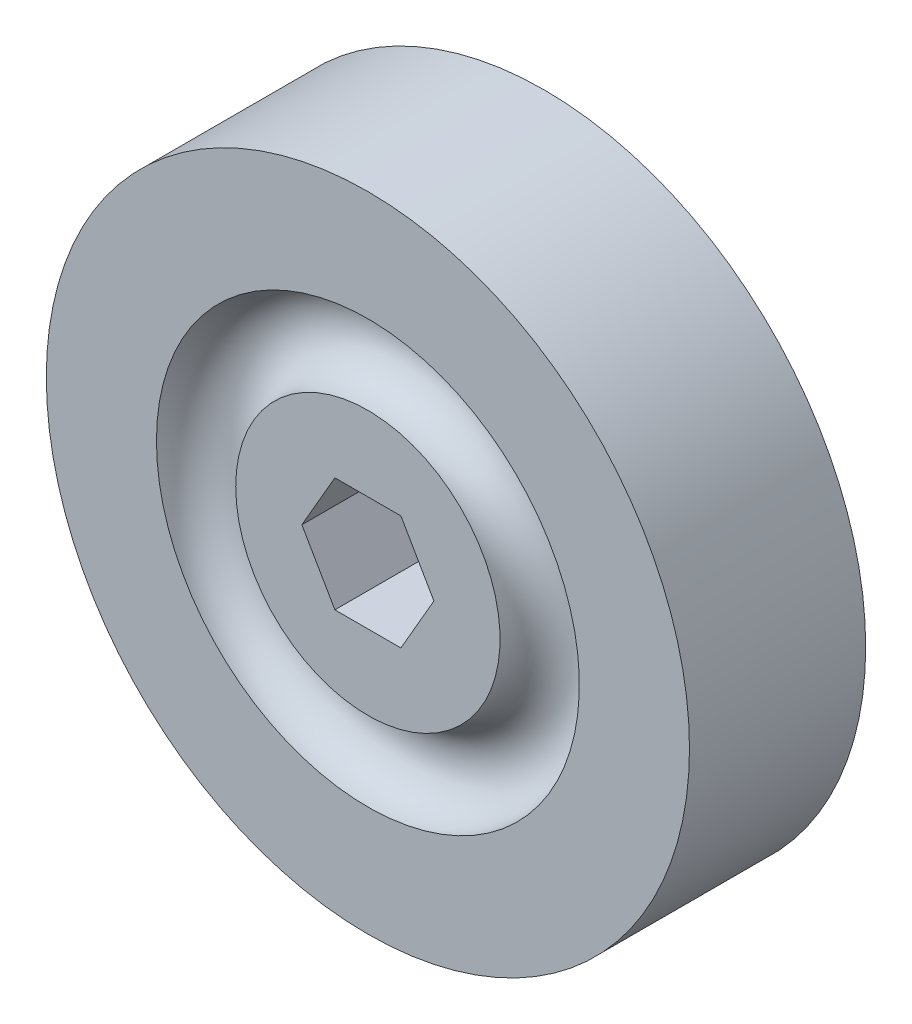
ISO-10303-21;
HEADER;
FILE_DESCRIPTION(('STEP AP214'),'2;1');
FILE_NAME('part.step','',(''),(''),'','','');
FILE_SCHEMA(('AUTOMOTIVE_DESIGN { 1 0 10303 214 1 1 1 1 }'));
ENDSEC;
DATA;
#1=APPLICATION_CONTEXT('core data for automotive mechanical design processes');
#2=APPLICATION_PROTOCOL_DEFINITION('international standard','automotive_design',2000,#1);
#3=PRODUCT_CONTEXT('',#1,'mechanical');
#4=PRODUCT('Part','Part','',(#3));
#5=PRODUCT_RELATED_PRODUCT_CATEGORY('part','',(#4));
#6=PRODUCT_DEFINITION_FORMATION('','',#4);
#7=PRODUCT_DEFINITION_CONTEXT('part definition',#1,'design');
#8=PRODUCT_DEFINITION('design','',#6,#7);
#9=PRODUCT_DEFINITION_SHAPE('','',#8);
#10=(LENGTH_UNIT() NAMED_UNIT(*) SI_UNIT(.MILLI.,.METRE.));
#11=(NAMED_UNIT(*) PLANE_ANGLE_UNIT() SI_UNIT($,.RADIAN.));
#12=(NAMED_UNIT(*) SI_UNIT($,.STERADIAN.) SOLID_ANGLE_UNIT());
#13=UNCERTAINTY_MEASURE_WITH_UNIT(LENGTH_MEASURE(1.E-05),#10,'distance_accuracy_value','');
#14=(GEOMETRIC_REPRESENTATION_CONTEXT(3) GLOBAL_UNCERTAINTY_ASSIGNED_CONTEXT((#13)) GLOBAL_UNIT_ASSIGNED_CONTEXT((#10,
#11,#12)) REPRESENTATION_CONTEXT('',''));
#15=CARTESIAN_POINT('',(0.,0.,0.));
#16=DIRECTION('',(0.,0.,1.));
#17=DIRECTION('',(1.,0.,0.));
#18=AXIS2_PLACEMENT_3D('',#15,#16,#17);
#19=CARTESIAN_POINT('',(0.,0.,20.));
#20=DIRECTION('',(0.,0.,1.));
#21=DIRECTION('',(1.,0.,0.));
#22=AXIS2_PLACEMENT_3D('',#19,#20,#21);
#23=PLANE('',#22);
#24=CARTESIAN_POINT('',(0.,0.,20.));
#25=DIRECTION('',(0.,0.,1.));
#26=DIRECTION('',(1.,0.,0.));
#27=AXIS2_PLACEMENT_3D('',#24,#25,#26);
#28=CIRCLE('',#27,36.5);
#29=CARTESIAN_POINT('',(36.5,0.,20.));
#30=VERTEX_POINT('',#29);
#31=EDGE_CURVE('E11',#30,#30,#28,.T.);
#32=ORIENTED_EDGE('',*,*,#31,.T.);
#33=EDGE_LOOP('',(#32));
#34=FACE_BOUND('',#33,.T.);
#35=CARTESIAN_POINT('',(0.,0.,20.));
#36=DIRECTION('',(0.,0.,-1.));
#37=DIRECTION('',(-1.,0.,0.));
#38=AXIS2_PLACEMENT_3D('',#35,#36,#37);
#39=CIRCLE('',#38,24.);
#40=CARTESIAN_POINT('',(-24.,0.,20.));
#41=VERTEX_POINT('',#40);
#42=EDGE_CURVE('E205',#41,#41,#39,.T.);
#43=ORIENTED_EDGE('',*,*,#42,.T.);
#44=EDGE_LOOP('',(#43));
#45=FACE_BOUND('',#44,.T.);
#46=ADVANCED_FACE('F34',(#34,#45),#23,.T.);
#47=DIRECTION('',(-0.5,0.866025403784438,0.));
#48=VECTOR('',#47,1.);
#49=CARTESIAN_POINT('',(7.493,0.,20.));
#50=LINE('',#49,#48);
#51=CARTESIAN_POINT('',(7.493,0.,20.));
#52=VERTEX_POINT('',#51);
#53=CARTESIAN_POINT('',(3.7465,6.4891283505568,20.));
#54=VERTEX_POINT('',#53);
#55=EDGE_CURVE('E106',#52,#54,#50,.T.);
#56=ORIENTED_EDGE('',*,*,#55,.F.);
#57=DIRECTION('',(0.5,0.866025403784439,0.));
#58=VECTOR('',#57,1.);
#59=CARTESIAN_POINT('',(3.7465,-6.4891283505568,20.));
#60=LINE('',#59,#58);
#61=CARTESIAN_POINT('',(3.7465,-6.4891283505568,20.));
#62=VERTEX_POINT('',#61);
#63=EDGE_CURVE('E96',#62,#52,#60,.T.);
#64=ORIENTED_EDGE('',*,*,#63,.F.);
#65=DIRECTION('',(1.,0.,0.));
#66=VECTOR('',#65,1.);
#67=CARTESIAN_POINT('',(-3.7465,-6.4891283505568,20.));
#68=LINE('',#67,#66);
#69=CARTESIAN_POINT('',(-3.7465,-6.4891283505568,20.));
#70=VERTEX_POINT('',#69);
#71=EDGE_CURVE('E130',#70,#62,#68,.T.);
#72=ORIENTED_EDGE('',*,*,#71,.F.);
#73=DIRECTION('',(0.5,-0.866025403784439,0.));
#74=VECTOR('',#73,1.);
#75=CARTESIAN_POINT('',(-7.493,0.,20.));
#76=LINE('',#75,#74);
#77=CARTESIAN_POINT('',(-7.493,0.,20.));
#78=VERTEX_POINT('',#77);
#79=EDGE_CURVE('E127',#78,#70,#76,.T.);
#80=ORIENTED_EDGE('',*,*,#79,.F.);
#81=DIRECTION('',(-0.5,-0.866025403784439,0.));
#82=VECTOR('',#81,1.);
#83=CARTESIAN_POINT('',(-3.7465,6.4891283505568,20.));
#84=LINE('',#83,#82);
#85=CARTESIAN_POINT('',(-3.7465,6.4891283505568,20.));
#86=VERTEX_POINT('',#85);
#87=EDGE_CURVE('E122',#86,#78,#84,.T.);
#88=ORIENTED_EDGE('',*,*,#87,.F.);
#89=DIRECTION('',(-1.,0.,0.));
#90=VECTOR('',#89,1.);
#91=CARTESIAN_POINT('',(3.7465,6.4891283505568,20.));
#92=LINE('',#91,#90);
#93=EDGE_CURVE('E120',#54,#86,#92,.T.);
#94=ORIENTED_EDGE('',*,*,#93,.F.);
#95=EDGE_LOOP('',(#56,#64,#72,#80,#88,#94));
#96=FACE_BOUND('',#95,.T.);
#97=CARTESIAN_POINT('',(0.,0.,20.));
#98=DIRECTION('',(0.,0.,-1.));
#99=DIRECTION('',(-1.,0.,0.));
#100=AXIS2_PLACEMENT_3D('',#97,#98,#99);
#101=CIRCLE('',#100,15.);
#102=CARTESIAN_POINT('',(-15.,0.,20.));
#103=VERTEX_POINT('',#102);
#104=EDGE_CURVE('E208',#103,#103,#101,.T.);
#105=ORIENTED_EDGE('',*,*,#104,.F.);
#106=EDGE_LOOP('',(#105));
#107=FACE_BOUND('',#106,.T.);
#108=ADVANCED_FACE('F117',(#96,#107),#23,.T.);
#109=CARTESIAN_POINT('',(0.,0.,0.));
#110=DIRECTION('',(0.,0.,1.));
#111=DIRECTION('',(1.,0.,0.));
#112=AXIS2_PLACEMENT_3D('',#109,#110,#111);
#113=PLANE('',#112);
#114=CARTESIAN_POINT('',(0.,0.,0.));
#115=DIRECTION('',(0.,0.,1.));
#116=DIRECTION('',(1.,0.,0.));
#117=AXIS2_PLACEMENT_3D('',#114,#115,#116);
#118=CIRCLE('',#117,36.5);
#119=CARTESIAN_POINT('',(36.5,0.,0.));
#120=VERTEX_POINT('',#119);
#121=EDGE_CURVE('E38',#120,#120,#118,.T.);
#122=ORIENTED_EDGE('',*,*,#121,.F.);
#123=EDGE_LOOP('',(#122));
#124=FACE_BOUND('',#123,.T.);
#125=CARTESIAN_POINT('',(0.,0.,0.));
#126=DIRECTION('',(0.,0.,-1.));
#127=DIRECTION('',(-1.,0.,0.));
#128=AXIS2_PLACEMENT_3D('',#125,#126,#127);
#129=CIRCLE('',#128,24.);
#130=CARTESIAN_POINT('',(-24.,0.,0.));
#131=VERTEX_POINT('',#130);
#132=EDGE_CURVE('E200',#131,#131,#129,.T.);
#133=ORIENTED_EDGE('',*,*,#132,.F.);
#134=EDGE_LOOP('',(#133));
#135=FACE_BOUND('',#134,.T.);
#136=ADVANCED_FACE('F186',(#124,#135),#113,.F.);
#137=DIRECTION('',(0.5,0.866025403784439,0.));
#138=VECTOR('',#137,1.);
#139=CARTESIAN_POINT('',(3.7465,-6.4891283505568,0.));
#140=LINE('',#139,#138);
#141=CARTESIAN_POINT('',(3.7465,-6.4891283505568,0.));
#142=VERTEX_POINT('',#141);
#143=CARTESIAN_POINT('',(7.493,0.,0.));
#144=VERTEX_POINT('',#143);
#145=EDGE_CURVE('E132',#142,#144,#140,.T.);
#146=ORIENTED_EDGE('',*,*,#145,.T.);
#147=DIRECTION('',(-0.5,0.866025403784438,0.));
#148=VECTOR('',#147,1.);
#149=CARTESIAN_POINT('',(7.493,0.,0.));
#150=LINE('',#149,#148);
#151=CARTESIAN_POINT('',(3.7465,6.4891283505568,0.));
#152=VERTEX_POINT('',#151);
#153=EDGE_CURVE('E113',#144,#152,#150,.T.);
#154=ORIENTED_EDGE('',*,*,#153,.T.);
#155=DIRECTION('',(-1.,0.,0.));
#156=VECTOR('',#155,1.);
#157=CARTESIAN_POINT('',(3.7465,6.4891283505568,0.));
#158=LINE('',#157,#156);
#159=CARTESIAN_POINT('',(-3.7465,6.4891283505568,0.));
#160=VERTEX_POINT('',#159);
#161=EDGE_CURVE('E136',#152,#160,#158,.T.);
#162=ORIENTED_EDGE('',*,*,#161,.T.);
#163=DIRECTION('',(-0.5,-0.866025403784439,0.));
#164=VECTOR('',#163,1.);
#165=CARTESIAN_POINT('',(-3.7465,6.4891283505568,0.));
#166=LINE('',#165,#164);
#167=CARTESIAN_POINT('',(-7.493,0.,0.));
#168=VERTEX_POINT('',#167);
#169=EDGE_CURVE('E139',#160,#168,#166,.T.);
#170=ORIENTED_EDGE('',*,*,#169,.T.);
#171=DIRECTION('',(0.5,-0.866025403784439,0.));
#172=VECTOR('',#171,1.);
#173=CARTESIAN_POINT('',(-7.493,0.,0.));
#174=LINE('',#173,#172);
#175=CARTESIAN_POINT('',(-3.7465,-6.4891283505568,0.));
#176=VERTEX_POINT('',#175);
#177=EDGE_CURVE('E142',#168,#176,#174,.T.);
#178=ORIENTED_EDGE('',*,*,#177,.T.);
#179=DIRECTION('',(1.,0.,0.));
#180=VECTOR('',#179,1.);
#181=CARTESIAN_POINT('',(-3.7465,-6.4891283505568,0.));
#182=LINE('',#181,#180);
#183=EDGE_CURVE('E107',#176,#142,#182,.T.);
#184=ORIENTED_EDGE('',*,*,#183,.T.);
#185=EDGE_LOOP('',(#146,#154,#162,#170,#178,#184));
#186=FACE_BOUND('',#185,.T.);
#187=CARTESIAN_POINT('',(0.,0.,0.));
#188=DIRECTION('',(0.,0.,-1.));
#189=DIRECTION('',(-1.,0.,0.));
#190=AXIS2_PLACEMENT_3D('',#187,#188,#189);
#191=CIRCLE('',#190,15.);
#192=CARTESIAN_POINT('',(-15.,0.,0.));
#193=VERTEX_POINT('',#192);
#194=EDGE_CURVE('E134',#193,#193,#191,.T.);
#195=ORIENTED_EDGE('',*,*,#194,.T.);
#196=EDGE_LOOP('',(#195));
#197=FACE_BOUND('',#196,.T.);
#198=ADVANCED_FACE('F160',(#186,#197),#113,.F.);
#199=CARTESIAN_POINT('',(0.,0.,20.));
#200=DIRECTION('',(0.,0.,-1.));
#201=DIRECTION('',(-1.,0.,0.));
#202=AXIS2_PLACEMENT_3D('',#199,#200,#201);
#203=CYLINDRICAL_SURFACE('',#202,36.5);
#204=ORIENTED_EDGE('',*,*,#31,.F.);
#205=EDGE_LOOP('',(#204));
#206=FACE_BOUND('',#205,.T.);
#207=ORIENTED_EDGE('',*,*,#121,.T.);
#208=EDGE_LOOP('',(#207));
#209=FACE_BOUND('',#208,.T.);
#210=ADVANCED_FACE('F36',(#206,#209),#203,.T.);
#211=CARTESIAN_POINT('',(3.7465,-6.4891283505568,20.));
#212=DIRECTION('',(-0.866025403784439,0.5,0.));
#213=DIRECTION('',(-0.5,-0.866025403784439,0.));
#214=AXIS2_PLACEMENT_3D('',#211,#212,#213);
#215=PLANE('',#214);
#216=ORIENTED_EDGE('',*,*,#145,.F.);
#217=DIRECTION('',(0.,0.,-1.));
#218=VECTOR('',#217,1.);
#219=CARTESIAN_POINT('',(3.7465,-6.4891283505568,20.));
#220=LINE('',#219,#218);
#221=EDGE_CURVE('E102',#62,#142,#220,.T.);
#222=ORIENTED_EDGE('',*,*,#221,.F.);
#223=ORIENTED_EDGE('',*,*,#63,.T.);
#224=DIRECTION('',(0.,0.,-1.));
#225=VECTOR('',#224,1.);
#226=CARTESIAN_POINT('',(7.493,0.,20.));
#227=LINE('',#226,#225);
#228=EDGE_CURVE('E99',#52,#144,#227,.T.);
#229=ORIENTED_EDGE('',*,*,#228,.T.);
#230=EDGE_LOOP('',(#216,#222,#223,#229));
#231=FACE_BOUND('',#230,.T.);
#232=ADVANCED_FACE('F98',(#231),#215,.T.);
#233=CARTESIAN_POINT('',(7.493,0.,20.));
#234=DIRECTION('',(-0.866025403784439,-0.5,0.));
#235=DIRECTION('',(0.5,-0.866025403784439,0.));
#236=AXIS2_PLACEMENT_3D('',#233,#234,#235);
#237=PLANE('',#236);
#238=ORIENTED_EDGE('',*,*,#153,.F.);
#239=ORIENTED_EDGE('',*,*,#228,.F.);
#240=ORIENTED_EDGE('',*,*,#55,.T.);
#241=DIRECTION('',(0.,0.,-1.));
#242=VECTOR('',#241,1.);
#243=CARTESIAN_POINT('',(3.7465,6.4891283505568,20.));
#244=LINE('',#243,#242);
#245=EDGE_CURVE('E114',#54,#152,#244,.T.);
#246=ORIENTED_EDGE('',*,*,#245,.T.);
#247=EDGE_LOOP('',(#238,#239,#240,#246));
#248=FACE_BOUND('',#247,.T.);
#249=ADVANCED_FACE('F110',(#248),#237,.T.);
#250=CARTESIAN_POINT('',(3.7465,6.4891283505568,20.));
#251=DIRECTION('',(0.,-1.,0.));
#252=DIRECTION('',(0.,0.,-1.));
#253=AXIS2_PLACEMENT_3D('',#250,#251,#252);
#254=PLANE('',#253);
#255=ORIENTED_EDGE('',*,*,#161,.F.);
#256=ORIENTED_EDGE('',*,*,#245,.F.);
#257=ORIENTED_EDGE('',*,*,#93,.T.);
#258=DIRECTION('',(0.,0.,-1.));
#259=VECTOR('',#258,1.);
#260=CARTESIAN_POINT('',(-3.7465,6.4891283505568,20.));
#261=LINE('',#260,#259);
#262=EDGE_CURVE('E152',#86,#160,#261,.T.);
#263=ORIENTED_EDGE('',*,*,#262,.T.);
#264=EDGE_LOOP('',(#255,#256,#257,#263));
#265=FACE_BOUND('',#264,.T.);
#266=ADVANCED_FACE('F156',(#265),#254,.T.);
#267=CARTESIAN_POINT('',(-3.7465,6.4891283505568,20.));
#268=DIRECTION('',(0.866025403784439,-0.5,0.));
#269=DIRECTION('',(0.5,0.866025403784439,0.));
#270=AXIS2_PLACEMENT_3D('',#267,#268,#269);
#271=PLANE('',#270);
#272=ORIENTED_EDGE('',*,*,#169,.F.);
#273=ORIENTED_EDGE('',*,*,#262,.F.);
#274=ORIENTED_EDGE('',*,*,#87,.T.);
#275=DIRECTION('',(0.,0.,-1.));
#276=VECTOR('',#275,1.);
#277=CARTESIAN_POINT('',(-7.493,0.,20.));
#278=LINE('',#277,#276);
#279=EDGE_CURVE('E150',#78,#168,#278,.T.);
#280=ORIENTED_EDGE('',*,*,#279,.T.);
#281=EDGE_LOOP('',(#272,#273,#274,#280));
#282=FACE_BOUND('',#281,.T.);
#283=ADVANCED_FACE('F171',(#282),#271,.T.);
#284=CARTESIAN_POINT('',(-7.493,0.,20.));
#285=DIRECTION('',(0.866025403784439,0.5,0.));
#286=DIRECTION('',(-0.5,0.866025403784439,0.));
#287=AXIS2_PLACEMENT_3D('',#284,#285,#286);
#288=PLANE('',#287);
#289=ORIENTED_EDGE('',*,*,#177,.F.);
#290=ORIENTED_EDGE('',*,*,#279,.F.);
#291=ORIENTED_EDGE('',*,*,#79,.T.);
#292=DIRECTION('',(0.,0.,-1.));
#293=VECTOR('',#292,1.);
#294=CARTESIAN_POINT('',(-3.7465,-6.4891283505568,20.));
#295=LINE('',#294,#293);
#296=EDGE_CURVE('E148',#70,#176,#295,.T.);
#297=ORIENTED_EDGE('',*,*,#296,.T.);
#298=EDGE_LOOP('',(#289,#290,#291,#297));
#299=FACE_BOUND('',#298,.T.);
#300=ADVANCED_FACE('F169',(#299),#288,.T.);
#301=CARTESIAN_POINT('',(-3.7465,-6.4891283505568,20.));
#302=DIRECTION('',(0.,1.,0.));
#303=DIRECTION('',(-1.,0.,0.));
#304=AXIS2_PLACEMENT_3D('',#301,#302,#303);
#305=PLANE('',#304);
#306=ORIENTED_EDGE('',*,*,#183,.F.);
#307=ORIENTED_EDGE('',*,*,#296,.F.);
#308=ORIENTED_EDGE('',*,*,#71,.T.);
#309=ORIENTED_EDGE('',*,*,#221,.T.);
#310=EDGE_LOOP('',(#306,#307,#308,#309));
#311=FACE_BOUND('',#310,.T.);
#312=ADVANCED_FACE('F164',(#311),#305,.T.);
#313=CARTESIAN_POINT('',(0.,0.,0.));
#314=DIRECTION('',(0.,0.,-1.));
#315=DIRECTION('',(-1.,0.,0.));
#316=AXIS2_PLACEMENT_3D('',#313,#314,#315);
#317=TOROIDAL_SURFACE('',#316,19.5,4.5);
#318=CARTESIAN_POINT('',(-19.5,0.,0.));
#319=DIRECTION('',(0.,1.,0.));
#320=DIRECTION('',(0.,0.,1.));
#321=AXIS2_PLACEMENT_3D('',#318,#319,#320);
#322=CIRCLE('',#321,4.5);
#323=EDGE_CURVE('E202',#131,#193,#322,.T.);
#324=ORIENTED_EDGE('',*,*,#323,.T.);
#325=ORIENTED_EDGE('',*,*,#194,.F.);
#326=ORIENTED_EDGE('',*,*,#323,.F.);
#327=ORIENTED_EDGE('',*,*,#132,.T.);
#328=EDGE_LOOP('',(#324,#325,#326,#327));
#329=FACE_BOUND('',#328,.T.);
#330=ADVANCED_FACE('F214',(#329),#317,.F.);
#331=CARTESIAN_POINT('',(0.,0.,20.));
#332=DIRECTION('',(0.,0.,-1.));
#333=DIRECTION('',(-1.,0.,0.));
#334=AXIS2_PLACEMENT_3D('',#331,#332,#333);
#335=TOROIDAL_SURFACE('',#334,19.5,4.5);
#336=CARTESIAN_POINT('',(-19.5,0.,20.));
#337=DIRECTION('',(0.,-1.,0.));
#338=DIRECTION('',(0.,0.,-1.));
#339=AXIS2_PLACEMENT_3D('',#336,#337,#338);
#340=CIRCLE('',#339,4.5);
#341=EDGE_CURVE('E49',#103,#41,#340,.F.);
#342=ORIENTED_EDGE('',*,*,#341,.T.);
#343=ORIENTED_EDGE('',*,*,#42,.F.);
#344=ORIENTED_EDGE('',*,*,#341,.F.);
#345=ORIENTED_EDGE('',*,*,#104,.T.);
#346=EDGE_LOOP('',(#342,#343,#344,#345));
#347=FACE_BOUND('',#346,.T.);
#348=ADVANCED_FACE('F212',(#347),#335,.F.);
#349=CLOSED_SHELL('',(#46,#108,#136,#198,#210,#232,#249,#266,#283,#300,#312,#330,#348));
#350=MANIFOLD_SOLID_BREP('B2',#349);
#351=ADVANCED_BREP_SHAPE_REPRESENTATION('',(#18,#350),#14);
#352=SHAPE_DEFINITION_REPRESENTATION(#9,#351);
ENDSEC;
END-ISO-10303-21;
